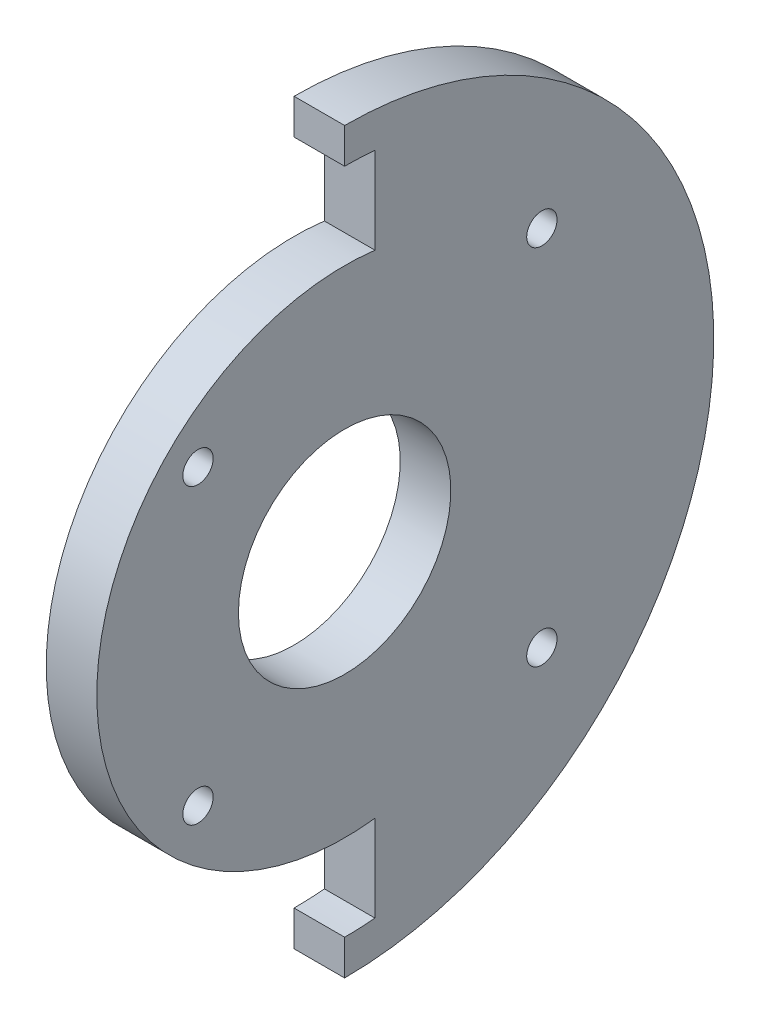
ISO-10303-21;
HEADER;
FILE_DESCRIPTION(('STEP AP214'),'2;1');
FILE_NAME('part.step','',(''),(''),'','','');
FILE_SCHEMA(('AUTOMOTIVE_DESIGN { 1 0 10303 214 1 1 1 1 }'));
ENDSEC;
DATA;
#1=APPLICATION_CONTEXT('core data for automotive mechanical design processes');
#2=APPLICATION_PROTOCOL_DEFINITION('international standard','automotive_design',2000,#1);
#3=PRODUCT_CONTEXT('',#1,'mechanical');
#4=PRODUCT('Part','Part','',(#3));
#5=PRODUCT_RELATED_PRODUCT_CATEGORY('part','',(#4));
#6=PRODUCT_DEFINITION_FORMATION('','',#4);
#7=PRODUCT_DEFINITION_CONTEXT('part definition',#1,'design');
#8=PRODUCT_DEFINITION('design','',#6,#7);
#9=PRODUCT_DEFINITION_SHAPE('','',#8);
#10=(LENGTH_UNIT() NAMED_UNIT(*) SI_UNIT(.MILLI.,.METRE.));
#11=(NAMED_UNIT(*) PLANE_ANGLE_UNIT() SI_UNIT($,.RADIAN.));
#12=(NAMED_UNIT(*) SI_UNIT($,.STERADIAN.) SOLID_ANGLE_UNIT());
#13=UNCERTAINTY_MEASURE_WITH_UNIT(LENGTH_MEASURE(1.E-05),#10,'distance_accuracy_value','');
#14=(GEOMETRIC_REPRESENTATION_CONTEXT(3) GLOBAL_UNCERTAINTY_ASSIGNED_CONTEXT((#13)) GLOBAL_UNIT_ASSIGNED_CONTEXT((#10,
#11,#12)) REPRESENTATION_CONTEXT('',''));
#15=CARTESIAN_POINT('',(0.,0.,0.));
#16=DIRECTION('',(0.,0.,1.));
#17=DIRECTION('',(1.,0.,0.));
#18=AXIS2_PLACEMENT_3D('',#15,#16,#17);
#19=CARTESIAN_POINT('',(-37.82021548315,0.,40.));
#20=DIRECTION('',(-1.,0.,0.));
#21=DIRECTION('',(0.,0.,1.));
#22=AXIS2_PLACEMENT_3D('',#19,#20,#21);
#23=CYLINDRICAL_SURFACE('',#22,33.);
#24=CARTESIAN_POINT('',(-135.7,0.,40.));
#25=DIRECTION('',(-1.,0.,0.));
#26=DIRECTION('',(0.,0.,1.));
#27=AXIS2_PLACEMENT_3D('',#24,#25,#26);
#28=CIRCLE('',#27,33.);
#29=CARTESIAN_POINT('',(-135.7,-32.86335345031,37.));
#30=VERTEX_POINT('',#29);
#31=CARTESIAN_POINT('',(-135.7,-33.,40.));
#32=VERTEX_POINT('',#31);
#33=EDGE_CURVE('E135',#30,#32,#28,.T.);
#34=ORIENTED_EDGE('',*,*,#33,.T.);
#35=DIRECTION('',(-1.,0.,0.));
#36=VECTOR('',#35,1.);
#37=CARTESIAN_POINT('',(-44.398419987325,-33.,40.));
#38=LINE('',#37,#36);
#39=CARTESIAN_POINT('',(-130.7,-33.,40.));
#40=VERTEX_POINT('',#39);
#41=EDGE_CURVE('E236',#40,#32,#38,.T.);
#42=ORIENTED_EDGE('',*,*,#41,.F.);
#43=CARTESIAN_POINT('',(-130.7,0.,40.));
#44=DIRECTION('',(1.,0.,0.));
#45=DIRECTION('',(0.,0.,-1.));
#46=AXIS2_PLACEMENT_3D('',#43,#44,#45);
#47=CIRCLE('',#46,33.);
#48=CARTESIAN_POINT('',(-130.7,-32.86335345031,37.));
#49=VERTEX_POINT('',#48);
#50=EDGE_CURVE('E151',#49,#40,#47,.F.);
#51=ORIENTED_EDGE('',*,*,#50,.F.);
#52=DIRECTION('',(-1.,0.,0.));
#53=VECTOR('',#52,1.);
#54=CARTESIAN_POINT('',(-37.82021548315,-32.86335345031,37.));
#55=LINE('',#54,#53);
#56=EDGE_CURVE('E133',#49,#30,#55,.T.);
#57=ORIENTED_EDGE('',*,*,#56,.T.);
#58=EDGE_LOOP('',(#34,#42,#51,#57));
#59=FACE_BOUND('',#58,.T.);
#60=ADVANCED_FACE('F40',(#59),#23,.F.);
#61=CARTESIAN_POINT('',(-130.7,0.,57.5));
#62=DIRECTION('',(1.,0.,0.));
#63=DIRECTION('',(0.,0.,-1.));
#64=AXIS2_PLACEMENT_3D('',#61,#62,#63);
#65=PLANE('',#64);
#66=DIRECTION('',(0.,1.,0.));
#67=VECTOR('',#66,1.);
#68=CARTESIAN_POINT('',(-130.7,0.,40.));
#69=LINE('',#68,#67);
#70=CARTESIAN_POINT('',(-130.7,-36.4933359959459,40.));
#71=VERTEX_POINT('',#70);
#72=EDGE_CURVE('E164',#71,#40,#69,.T.);
#73=ORIENTED_EDGE('',*,*,#72,.F.);
#74=CARTESIAN_POINT('',(-130.7,0.,40.));
#75=DIRECTION('',(1.,0.,0.));
#76=DIRECTION('',(0.,0.,-1.));
#77=AXIS2_PLACEMENT_3D('',#74,#75,#76);
#78=CIRCLE('',#77,36.4933359959459);
#79=CARTESIAN_POINT('',(-130.7,36.4933359959459,40.));
#80=VERTEX_POINT('',#79);
#81=EDGE_CURVE('E146',#71,#80,#78,.T.);
#82=ORIENTED_EDGE('',*,*,#81,.T.);
#83=DIRECTION('',(0.,1.,0.));
#84=VECTOR('',#83,1.);
#85=CARTESIAN_POINT('',(-130.7,0.,40.));
#86=LINE('',#85,#84);
#87=CARTESIAN_POINT('',(-130.7,33.,40.));
#88=VERTEX_POINT('',#87);
#89=EDGE_CURVE('E55',#88,#80,#86,.T.);
#90=ORIENTED_EDGE('',*,*,#89,.F.);
#91=CARTESIAN_POINT('',(-130.7,32.86335345031,37.));
#92=VERTEX_POINT('',#91);
#93=EDGE_CURVE('E153',#88,#92,#47,.F.);
#94=ORIENTED_EDGE('',*,*,#93,.T.);
#95=DIRECTION('',(0.,1.,0.));
#96=VECTOR('',#95,1.);
#97=CARTESIAN_POINT('',(-130.7,0.,37.));
#98=LINE('',#97,#96);
#99=CARTESIAN_POINT('',(-130.7,24.3156328315757,37.));
#100=VERTEX_POINT('',#99);
#101=EDGE_CURVE('E140',#100,#92,#98,.T.);
#102=ORIENTED_EDGE('',*,*,#101,.F.);
#103=CARTESIAN_POINT('',(-130.7,0.,40.));
#104=DIRECTION('',(1.,0.,0.));
#105=DIRECTION('',(0.,0.,-1.));
#106=AXIS2_PLACEMENT_3D('',#103,#104,#105);
#107=CIRCLE('',#106,24.5);
#108=CARTESIAN_POINT('',(-130.7,-24.3156328315757,37.));
#109=VERTEX_POINT('',#108);
#110=EDGE_CURVE('E143',#109,#100,#107,.F.);
#111=ORIENTED_EDGE('',*,*,#110,.F.);
#112=DIRECTION('',(0.,-1.,0.));
#113=VECTOR('',#112,1.);
#114=CARTESIAN_POINT('',(-130.7,0.,37.));
#115=LINE('',#114,#113);
#116=EDGE_CURVE('E148',#109,#49,#115,.T.);
#117=ORIENTED_EDGE('',*,*,#116,.T.);
#118=ORIENTED_EDGE('',*,*,#50,.T.);
#119=EDGE_LOOP('',(#73,#82,#90,#94,#102,#111,#117,#118));
#120=FACE_BOUND('',#119,.T.);
#121=CARTESIAN_POINT('',(-130.7,-14.4956890143242,54.4956890143243));
#122=DIRECTION('',(1.,0.,0.));
#123=DIRECTION('',(0.,0.,-1.));
#124=AXIS2_PLACEMENT_3D('',#121,#122,#123);
#125=CIRCLE('',#124,1.5);
#126=CARTESIAN_POINT('',(-130.7,-14.4956890143242,52.9956890143243));
#127=VERTEX_POINT('',#126);
#128=EDGE_CURVE('E175',#127,#127,#125,.T.);
#129=ORIENTED_EDGE('',*,*,#128,.F.);
#130=EDGE_LOOP('',(#129));
#131=FACE_BOUND('',#130,.T.);
#132=CARTESIAN_POINT('',(-130.7,17.9443584449264,20.5));
#133=DIRECTION('',(1.,0.,0.));
#134=DIRECTION('',(0.,0.,-1.));
#135=AXIS2_PLACEMENT_3D('',#132,#133,#134);
#136=CIRCLE('',#135,1.5);
#137=CARTESIAN_POINT('',(-130.7,17.9443584449264,19.));
#138=VERTEX_POINT('',#137);
#139=EDGE_CURVE('E172',#138,#138,#136,.T.);
#140=ORIENTED_EDGE('',*,*,#139,.F.);
#141=EDGE_LOOP('',(#140));
#142=FACE_BOUND('',#141,.T.);
#143=CARTESIAN_POINT('',(-130.7,-17.9443584449264,20.5));
#144=DIRECTION('',(1.,0.,0.));
#145=DIRECTION('',(0.,0.,-1.));
#146=AXIS2_PLACEMENT_3D('',#143,#144,#145);
#147=CIRCLE('',#146,1.5);
#148=CARTESIAN_POINT('',(-130.7,-17.9443584449264,19.));
#149=VERTEX_POINT('',#148);
#150=EDGE_CURVE('E168',#149,#149,#147,.T.);
#151=ORIENTED_EDGE('',*,*,#150,.F.);
#152=EDGE_LOOP('',(#151));
#153=FACE_BOUND('',#152,.T.);
#154=CARTESIAN_POINT('',(-130.7,14.4956890143242,54.4956890143243));
#155=DIRECTION('',(1.,0.,0.));
#156=DIRECTION('',(0.,0.,-1.));
#157=AXIS2_PLACEMENT_3D('',#154,#155,#156);
#158=CIRCLE('',#157,1.5);
#159=CARTESIAN_POINT('',(-130.7,14.4956890143242,52.9956890143243));
#160=VERTEX_POINT('',#159);
#161=EDGE_CURVE('E163',#160,#160,#158,.T.);
#162=ORIENTED_EDGE('',*,*,#161,.F.);
#163=EDGE_LOOP('',(#162));
#164=FACE_BOUND('',#163,.T.);
#165=CARTESIAN_POINT('',(-130.7,0.,40.));
#166=DIRECTION('',(-1.,0.,0.));
#167=DIRECTION('',(0.,0.,1.));
#168=AXIS2_PLACEMENT_3D('',#165,#166,#167);
#169=CIRCLE('',#168,10.5);
#170=CARTESIAN_POINT('',(-130.7,0.,50.5));
#171=VERTEX_POINT('',#170);
#172=EDGE_CURVE('E125',#171,#171,#169,.T.);
#173=ORIENTED_EDGE('',*,*,#172,.T.);
#174=EDGE_LOOP('',(#173));
#175=FACE_BOUND('',#174,.T.);
#176=ADVANCED_FACE('F189',(#120,#131,#142,#153,#164,#175),#65,.T.);
#177=CARTESIAN_POINT('',(-37.82021548315,0.,40.));
#178=DIRECTION('',(-1.,0.,0.));
#179=DIRECTION('',(0.,0.,1.));
#180=AXIS2_PLACEMENT_3D('',#177,#178,#179);
#181=CYLINDRICAL_SURFACE('',#180,24.5);
#182=DIRECTION('',(-1.,0.,0.));
#183=VECTOR('',#182,1.);
#184=CARTESIAN_POINT('',(-37.82021548315,-24.3156328315757,37.));
#185=LINE('',#184,#183);
#186=CARTESIAN_POINT('',(-135.7,-24.3156328315757,37.));
#187=VERTEX_POINT('',#186);
#188=EDGE_CURVE('E119',#109,#187,#185,.T.);
#189=ORIENTED_EDGE('',*,*,#188,.F.);
#190=ORIENTED_EDGE('',*,*,#110,.T.);
#191=DIRECTION('',(-1.,0.,0.));
#192=VECTOR('',#191,1.);
#193=CARTESIAN_POINT('',(-37.82021548315,24.3156328315757,37.));
#194=LINE('',#193,#192);
#195=CARTESIAN_POINT('',(-135.7,24.3156328315757,37.));
#196=VERTEX_POINT('',#195);
#197=EDGE_CURVE('E122',#100,#196,#194,.T.);
#198=ORIENTED_EDGE('',*,*,#197,.T.);
#199=CARTESIAN_POINT('',(-135.7,0.,40.));
#200=DIRECTION('',(-1.,0.,0.));
#201=DIRECTION('',(0.,0.,1.));
#202=AXIS2_PLACEMENT_3D('',#199,#200,#201);
#203=CIRCLE('',#202,24.5);
#204=EDGE_CURVE('E129',#187,#196,#203,.T.);
#205=ORIENTED_EDGE('',*,*,#204,.F.);
#206=EDGE_LOOP('',(#189,#190,#198,#205));
#207=FACE_BOUND('',#206,.T.);
#208=ADVANCED_FACE('F208',(#207),#181,.T.);
#209=CARTESIAN_POINT('',(-37.82021548315,0.,37.));
#210=DIRECTION('',(0.,0.,1.));
#211=DIRECTION('',(0.,-1.,0.));
#212=AXIS2_PLACEMENT_3D('',#209,#210,#211);
#213=PLANE('',#212);
#214=ORIENTED_EDGE('',*,*,#197,.F.);
#215=ORIENTED_EDGE('',*,*,#101,.T.);
#216=DIRECTION('',(-1.,0.,0.));
#217=VECTOR('',#216,1.);
#218=CARTESIAN_POINT('',(-37.82021548315,32.86335345031,37.));
#219=LINE('',#218,#217);
#220=CARTESIAN_POINT('',(-135.7,32.86335345031,37.));
#221=VERTEX_POINT('',#220);
#222=EDGE_CURVE('E156',#92,#221,#219,.T.);
#223=ORIENTED_EDGE('',*,*,#222,.T.);
#224=DIRECTION('',(0.,1.,0.));
#225=VECTOR('',#224,1.);
#226=CARTESIAN_POINT('',(-135.7,0.,37.));
#227=LINE('',#226,#225);
#228=EDGE_CURVE('E132',#196,#221,#227,.T.);
#229=ORIENTED_EDGE('',*,*,#228,.F.);
#230=EDGE_LOOP('',(#214,#215,#223,#229));
#231=FACE_BOUND('',#230,.T.);
#232=ADVANCED_FACE('F199',(#231),#213,.T.);
#233=CARTESIAN_POINT('',(-135.7,10.5,40.));
#234=DIRECTION('',(1.,0.,0.));
#235=DIRECTION('',(0.,0.,-1.));
#236=AXIS2_PLACEMENT_3D('',#233,#234,#235);
#237=PLANE('',#236);
#238=CARTESIAN_POINT('',(-135.7,-14.4956890143242,54.4956890143243));
#239=DIRECTION('',(1.,0.,0.));
#240=DIRECTION('',(0.,0.,-1.));
#241=AXIS2_PLACEMENT_3D('',#238,#239,#240);
#242=CIRCLE('',#241,1.5);
#243=CARTESIAN_POINT('',(-135.7,-14.4956890143242,52.9956890143243));
#244=VERTEX_POINT('',#243);
#245=EDGE_CURVE('E173',#244,#244,#242,.T.);
#246=ORIENTED_EDGE('',*,*,#245,.T.);
#247=EDGE_LOOP('',(#246));
#248=FACE_BOUND('',#247,.T.);
#249=CARTESIAN_POINT('',(-135.7,17.9443584449264,20.5));
#250=DIRECTION('',(1.,0.,0.));
#251=DIRECTION('',(0.,0.,-1.));
#252=AXIS2_PLACEMENT_3D('',#249,#250,#251);
#253=CIRCLE('',#252,1.5);
#254=CARTESIAN_POINT('',(-135.7,17.9443584449264,19.));
#255=VERTEX_POINT('',#254);
#256=EDGE_CURVE('E169',#255,#255,#253,.T.);
#257=ORIENTED_EDGE('',*,*,#256,.T.);
#258=EDGE_LOOP('',(#257));
#259=FACE_BOUND('',#258,.T.);
#260=CARTESIAN_POINT('',(-135.7,-17.9443584449264,20.5));
#261=DIRECTION('',(1.,0.,0.));
#262=DIRECTION('',(0.,0.,-1.));
#263=AXIS2_PLACEMENT_3D('',#260,#261,#262);
#264=CIRCLE('',#263,1.5);
#265=CARTESIAN_POINT('',(-135.7,-17.9443584449264,19.));
#266=VERTEX_POINT('',#265);
#267=EDGE_CURVE('E165',#266,#266,#264,.T.);
#268=ORIENTED_EDGE('',*,*,#267,.T.);
#269=EDGE_LOOP('',(#268));
#270=FACE_BOUND('',#269,.T.);
#271=CARTESIAN_POINT('',(-135.7,14.4956890143242,54.4956890143243));
#272=DIRECTION('',(1.,0.,0.));
#273=DIRECTION('',(0.,0.,-1.));
#274=AXIS2_PLACEMENT_3D('',#271,#272,#273);
#275=CIRCLE('',#274,1.5);
#276=CARTESIAN_POINT('',(-135.7,14.4956890143242,52.9956890143243));
#277=VERTEX_POINT('',#276);
#278=EDGE_CURVE('E160',#277,#277,#275,.T.);
#279=ORIENTED_EDGE('',*,*,#278,.T.);
#280=EDGE_LOOP('',(#279));
#281=FACE_BOUND('',#280,.T.);
#282=CARTESIAN_POINT('',(-135.7,0.,40.));
#283=DIRECTION('',(-1.,0.,0.));
#284=DIRECTION('',(0.,0.,1.));
#285=AXIS2_PLACEMENT_3D('',#282,#283,#284);
#286=CIRCLE('',#285,36.4933359959459);
#287=CARTESIAN_POINT('',(-135.7,36.4933359959459,40.));
#288=VERTEX_POINT('',#287);
#289=CARTESIAN_POINT('',(-135.7,-36.4933359959459,40.));
#290=VERTEX_POINT('',#289);
#291=EDGE_CURVE('E115',#288,#290,#286,.T.);
#292=ORIENTED_EDGE('',*,*,#291,.T.);
#293=DIRECTION('',(0.,-1.,0.));
#294=VECTOR('',#293,1.);
#295=CARTESIAN_POINT('',(-135.7,0.,40.));
#296=LINE('',#295,#294);
#297=EDGE_CURVE('E63',#32,#290,#296,.T.);
#298=ORIENTED_EDGE('',*,*,#297,.F.);
#299=ORIENTED_EDGE('',*,*,#33,.F.);
#300=DIRECTION('',(0.,-1.,0.));
#301=VECTOR('',#300,1.);
#302=CARTESIAN_POINT('',(-135.7,0.,37.));
#303=LINE('',#302,#301);
#304=EDGE_CURVE('E109',#187,#30,#303,.T.);
#305=ORIENTED_EDGE('',*,*,#304,.F.);
#306=ORIENTED_EDGE('',*,*,#204,.T.);
#307=ORIENTED_EDGE('',*,*,#228,.T.);
#308=CARTESIAN_POINT('',(-135.7,33.,40.));
#309=VERTEX_POINT('',#308);
#310=EDGE_CURVE('E117',#309,#221,#28,.T.);
#311=ORIENTED_EDGE('',*,*,#310,.F.);
#312=EDGE_CURVE('E103',#288,#309,#296,.T.);
#313=ORIENTED_EDGE('',*,*,#312,.F.);
#314=EDGE_LOOP('',(#292,#298,#299,#305,#306,#307,#311,#313));
#315=FACE_BOUND('',#314,.T.);
#316=CARTESIAN_POINT('',(-135.7,0.,40.));
#317=DIRECTION('',(-1.,0.,0.));
#318=DIRECTION('',(0.,0.,1.));
#319=AXIS2_PLACEMENT_3D('',#316,#317,#318);
#320=CIRCLE('',#319,10.5);
#321=CARTESIAN_POINT('',(-135.7,0.,50.5));
#322=VERTEX_POINT('',#321);
#323=EDGE_CURVE('E120',#322,#322,#320,.T.);
#324=ORIENTED_EDGE('',*,*,#323,.F.);
#325=EDGE_LOOP('',(#324));
#326=FACE_BOUND('',#325,.T.);
#327=ADVANCED_FACE('F113',(#248,#259,#270,#281,#315,#326),#237,.F.);
#328=CARTESIAN_POINT('',(-37.82021548315,0.,37.));
#329=DIRECTION('',(0.,0.,-1.));
#330=DIRECTION('',(-1.,0.,0.));
#331=AXIS2_PLACEMENT_3D('',#328,#329,#330);
#332=PLANE('',#331);
#333=ORIENTED_EDGE('',*,*,#116,.F.);
#334=ORIENTED_EDGE('',*,*,#188,.T.);
#335=ORIENTED_EDGE('',*,*,#304,.T.);
#336=ORIENTED_EDGE('',*,*,#56,.F.);
#337=EDGE_LOOP('',(#333,#334,#335,#336));
#338=FACE_BOUND('',#337,.T.);
#339=ADVANCED_FACE('F198',(#338),#332,.F.);
#340=ORIENTED_EDGE('',*,*,#93,.F.);
#341=DIRECTION('',(-1.,0.,0.));
#342=VECTOR('',#341,1.);
#343=CARTESIAN_POINT('',(-44.398419987325,33.,40.));
#344=LINE('',#343,#342);
#345=EDGE_CURVE('E237',#88,#309,#344,.T.);
#346=ORIENTED_EDGE('',*,*,#345,.T.);
#347=ORIENTED_EDGE('',*,*,#310,.T.);
#348=ORIENTED_EDGE('',*,*,#222,.F.);
#349=EDGE_LOOP('',(#340,#346,#347,#348));
#350=FACE_BOUND('',#349,.T.);
#351=ADVANCED_FACE('F205',(#350),#23,.F.);
#352=CARTESIAN_POINT('',(-135.7,0.,40.));
#353=DIRECTION('',(-1.,0.,0.));
#354=DIRECTION('',(0.,0.,1.));
#355=AXIS2_PLACEMENT_3D('',#352,#353,#354);
#356=CYLINDRICAL_SURFACE('',#355,36.4933359959459);
#357=ORIENTED_EDGE('',*,*,#81,.F.);
#358=DIRECTION('',(-1.,0.,0.));
#359=VECTOR('',#358,1.);
#360=CARTESIAN_POINT('',(-135.7,-36.4933359959459,40.));
#361=LINE('',#360,#359);
#362=EDGE_CURVE('E11',#71,#290,#361,.T.);
#363=ORIENTED_EDGE('',*,*,#362,.T.);
#364=ORIENTED_EDGE('',*,*,#291,.F.);
#365=DIRECTION('',(-1.,0.,0.));
#366=VECTOR('',#365,1.);
#367=CARTESIAN_POINT('',(-135.7,36.4933359959459,40.));
#368=LINE('',#367,#366);
#369=EDGE_CURVE('E48',#288,#80,#368,.F.);
#370=ORIENTED_EDGE('',*,*,#369,.T.);
#371=EDGE_LOOP('',(#357,#363,#364,#370));
#372=FACE_BOUND('',#371,.T.);
#373=ADVANCED_FACE('F42',(#372),#356,.T.);
#374=CARTESIAN_POINT('',(-135.7,0.,40.));
#375=DIRECTION('',(-1.,0.,0.));
#376=DIRECTION('',(0.,0.,1.));
#377=AXIS2_PLACEMENT_3D('',#374,#375,#376);
#378=CYLINDRICAL_SURFACE('',#377,10.5);
#379=ORIENTED_EDGE('',*,*,#172,.F.);
#380=EDGE_LOOP('',(#379));
#381=FACE_BOUND('',#380,.T.);
#382=ORIENTED_EDGE('',*,*,#323,.T.);
#383=EDGE_LOOP('',(#382));
#384=FACE_BOUND('',#383,.T.);
#385=ADVANCED_FACE('F191',(#381,#384),#378,.F.);
#386=CARTESIAN_POINT('',(-146.2,14.4956890143242,54.4956890143243));
#387=DIRECTION('',(1.,0.,0.));
#388=DIRECTION('',(0.,0.,-1.));
#389=AXIS2_PLACEMENT_3D('',#386,#387,#388);
#390=CYLINDRICAL_SURFACE('',#389,1.5);
#391=ORIENTED_EDGE('',*,*,#161,.T.);
#392=EDGE_LOOP('',(#391));
#393=FACE_BOUND('',#392,.T.);
#394=ORIENTED_EDGE('',*,*,#278,.F.);
#395=EDGE_LOOP('',(#394));
#396=FACE_BOUND('',#395,.T.);
#397=ADVANCED_FACE('F194',(#393,#396),#390,.F.);
#398=CARTESIAN_POINT('',(-146.2,-17.9443584449264,20.5));
#399=DIRECTION('',(1.,0.,0.));
#400=DIRECTION('',(0.,0.,-1.));
#401=AXIS2_PLACEMENT_3D('',#398,#399,#400);
#402=CYLINDRICAL_SURFACE('',#401,1.5);
#403=ORIENTED_EDGE('',*,*,#150,.T.);
#404=EDGE_LOOP('',(#403));
#405=FACE_BOUND('',#404,.T.);
#406=ORIENTED_EDGE('',*,*,#267,.F.);
#407=EDGE_LOOP('',(#406));
#408=FACE_BOUND('',#407,.T.);
#409=ADVANCED_FACE('F248',(#405,#408),#402,.F.);
#410=CARTESIAN_POINT('',(-146.2,17.9443584449264,20.5));
#411=DIRECTION('',(1.,0.,0.));
#412=DIRECTION('',(0.,0.,-1.));
#413=AXIS2_PLACEMENT_3D('',#410,#411,#412);
#414=CYLINDRICAL_SURFACE('',#413,1.5);
#415=ORIENTED_EDGE('',*,*,#139,.T.);
#416=EDGE_LOOP('',(#415));
#417=FACE_BOUND('',#416,.T.);
#418=ORIENTED_EDGE('',*,*,#256,.F.);
#419=EDGE_LOOP('',(#418));
#420=FACE_BOUND('',#419,.T.);
#421=ADVANCED_FACE('F255',(#417,#420),#414,.F.);
#422=CARTESIAN_POINT('',(-146.2,-14.4956890143242,54.4956890143243));
#423=DIRECTION('',(1.,0.,0.));
#424=DIRECTION('',(0.,0.,-1.));
#425=AXIS2_PLACEMENT_3D('',#422,#423,#424);
#426=CYLINDRICAL_SURFACE('',#425,1.5);
#427=ORIENTED_EDGE('',*,*,#128,.T.);
#428=EDGE_LOOP('',(#427));
#429=FACE_BOUND('',#428,.T.);
#430=ORIENTED_EDGE('',*,*,#245,.F.);
#431=EDGE_LOOP('',(#430));
#432=FACE_BOUND('',#431,.T.);
#433=ADVANCED_FACE('F261',(#429,#432),#426,.F.);
#434=CARTESIAN_POINT('',(-44.398419987325,0.,40.));
#435=DIRECTION('',(0.,0.,-1.));
#436=DIRECTION('',(0.,1.,0.));
#437=AXIS2_PLACEMENT_3D('',#434,#435,#436);
#438=PLANE('',#437);
#439=ORIENTED_EDGE('',*,*,#89,.T.);
#440=ORIENTED_EDGE('',*,*,#369,.F.);
#441=ORIENTED_EDGE('',*,*,#312,.T.);
#442=ORIENTED_EDGE('',*,*,#345,.F.);
#443=EDGE_LOOP('',(#439,#440,#441,#442));
#444=FACE_BOUND('',#443,.T.);
#445=ADVANCED_FACE('F102',(#444),#438,.F.);
#446=ORIENTED_EDGE('',*,*,#72,.T.);
#447=ORIENTED_EDGE('',*,*,#41,.T.);
#448=ORIENTED_EDGE('',*,*,#297,.T.);
#449=ORIENTED_EDGE('',*,*,#362,.F.);
#450=EDGE_LOOP('',(#446,#447,#448,#449));
#451=FACE_BOUND('',#450,.T.);
#452=ADVANCED_FACE('F265',(#451),#438,.F.);
#453=CLOSED_SHELL('',(#60,#176,#208,#232,#327,#339,#351,#373,#385,#397,#409,#421,#433,#445,#452));
#454=MANIFOLD_SOLID_BREP('B2',#453);
#455=ADVANCED_BREP_SHAPE_REPRESENTATION('',(#18,#454),#14);
#456=SHAPE_DEFINITION_REPRESENTATION(#9,#455);
ENDSEC;
END-ISO-10303-21;
